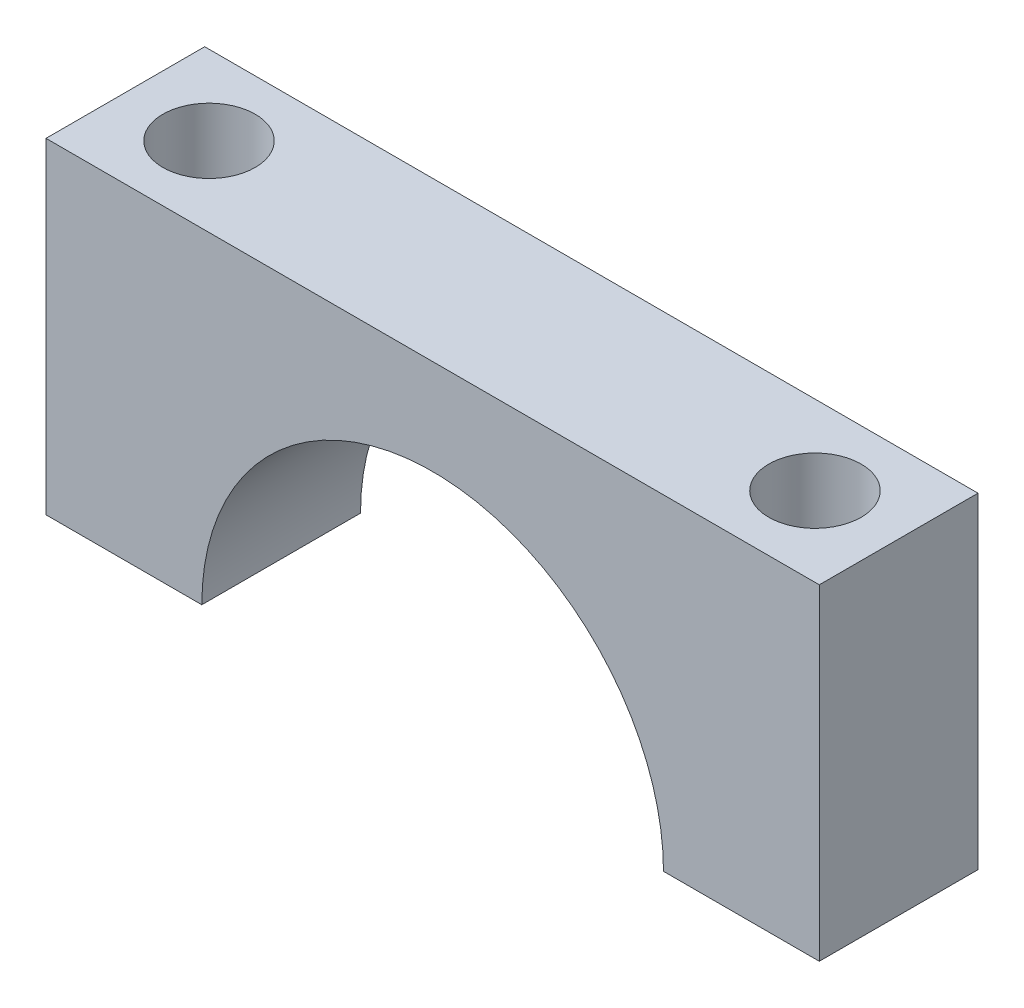
ISO-10303-21;
HEADER;
FILE_DESCRIPTION(('STEP AP214'),'2;1');
FILE_NAME('part.step','',(''),(''),'','','');
FILE_SCHEMA(('AUTOMOTIVE_DESIGN { 1 0 10303 214 1 1 1 1 }'));
ENDSEC;
DATA;
#1=APPLICATION_CONTEXT('core data for automotive mechanical design processes');
#2=APPLICATION_PROTOCOL_DEFINITION('international standard','automotive_design',2000,#1);
#3=PRODUCT_CONTEXT('',#1,'mechanical');
#4=PRODUCT('Part','Part','',(#3));
#5=PRODUCT_RELATED_PRODUCT_CATEGORY('part','',(#4));
#6=PRODUCT_DEFINITION_FORMATION('','',#4);
#7=PRODUCT_DEFINITION_CONTEXT('part definition',#1,'design');
#8=PRODUCT_DEFINITION('design','',#6,#7);
#9=PRODUCT_DEFINITION_SHAPE('','',#8);
#10=(LENGTH_UNIT() NAMED_UNIT(*) SI_UNIT(.MILLI.,.METRE.));
#11=(NAMED_UNIT(*) PLANE_ANGLE_UNIT() SI_UNIT($,.RADIAN.));
#12=(NAMED_UNIT(*) SI_UNIT($,.STERADIAN.) SOLID_ANGLE_UNIT());
#13=UNCERTAINTY_MEASURE_WITH_UNIT(LENGTH_MEASURE(1.E-05),#10,'distance_accuracy_value','');
#14=(GEOMETRIC_REPRESENTATION_CONTEXT(3) GLOBAL_UNCERTAINTY_ASSIGNED_CONTEXT((#13)) GLOBAL_UNIT_ASSIGNED_CONTEXT((#10,
#11,#12)) REPRESENTATION_CONTEXT('',''));
#15=CARTESIAN_POINT('',(0.,0.,0.));
#16=DIRECTION('',(0.,0.,1.));
#17=DIRECTION('',(1.,0.,0.));
#18=AXIS2_PLACEMENT_3D('',#15,#16,#17);
#19=CARTESIAN_POINT('',(-13.4,11.3,2.75));
#20=DIRECTION('',(1.,0.,0.));
#21=DIRECTION('',(0.,1.,0.));
#22=AXIS2_PLACEMENT_3D('',#19,#20,#21);
#23=PLANE('',#22);
#24=DIRECTION('',(0.,-1.,0.));
#25=VECTOR('',#24,1.);
#26=CARTESIAN_POINT('',(-13.4,11.3,-2.75));
#27=LINE('',#26,#25);
#28=CARTESIAN_POINT('',(-13.4,11.3,-2.75));
#29=VERTEX_POINT('',#28);
#30=CARTESIAN_POINT('',(-13.4,0.,-2.75));
#31=VERTEX_POINT('',#30);
#32=EDGE_CURVE('E123',#29,#31,#27,.T.);
#33=ORIENTED_EDGE('',*,*,#32,.T.);
#34=DIRECTION('',(0.,0.,-1.));
#35=VECTOR('',#34,1.);
#36=CARTESIAN_POINT('',(-13.4,0.,2.75));
#37=LINE('',#36,#35);
#38=CARTESIAN_POINT('',(-13.4,0.,2.75));
#39=VERTEX_POINT('',#38);
#40=EDGE_CURVE('E11',#39,#31,#37,.T.);
#41=ORIENTED_EDGE('',*,*,#40,.F.);
#42=DIRECTION('',(0.,-1.,0.));
#43=VECTOR('',#42,1.);
#44=CARTESIAN_POINT('',(-13.4,11.3,2.75));
#45=LINE('',#44,#43);
#46=CARTESIAN_POINT('',(-13.4,11.3,2.75));
#47=VERTEX_POINT('',#46);
#48=EDGE_CURVE('E134',#47,#39,#45,.T.);
#49=ORIENTED_EDGE('',*,*,#48,.F.);
#50=DIRECTION('',(0.,0.,-1.));
#51=VECTOR('',#50,1.);
#52=CARTESIAN_POINT('',(-13.4,11.3,2.75));
#53=LINE('',#52,#51);
#54=EDGE_CURVE('E119',#47,#29,#53,.T.);
#55=ORIENTED_EDGE('',*,*,#54,.T.);
#56=EDGE_LOOP('',(#33,#41,#49,#55));
#57=FACE_BOUND('',#56,.T.);
#58=ADVANCED_FACE('F39',(#57),#23,.F.);
#59=CARTESIAN_POINT('',(-13.4,0.,2.75));
#60=DIRECTION('',(0.,1.,0.));
#61=DIRECTION('',(-1.,0.,0.));
#62=AXIS2_PLACEMENT_3D('',#59,#60,#61);
#63=PLANE('',#62);
#64=CARTESIAN_POINT('',(-10.5,0.,0.));
#65=DIRECTION('',(0.,-1.,0.));
#66=DIRECTION('',(1.,0.,0.));
#67=AXIS2_PLACEMENT_3D('',#64,#65,#66);
#68=CIRCLE('',#67,1.6);
#69=CARTESIAN_POINT('',(-8.9,0.,0.));
#70=VERTEX_POINT('',#69);
#71=EDGE_CURVE('E185',#70,#70,#68,.T.);
#72=ORIENTED_EDGE('',*,*,#71,.F.);
#73=EDGE_LOOP('',(#72));
#74=FACE_BOUND('',#73,.T.);
#75=DIRECTION('',(1.,0.,0.));
#76=VECTOR('',#75,1.);
#77=CARTESIAN_POINT('',(-13.4,0.,-2.75));
#78=LINE('',#77,#76);
#79=CARTESIAN_POINT('',(-8.,0.,-2.75));
#80=VERTEX_POINT('',#79);
#81=EDGE_CURVE('E126',#31,#80,#78,.T.);
#82=ORIENTED_EDGE('',*,*,#81,.T.);
#83=DIRECTION('',(0.,0.,-1.));
#84=VECTOR('',#83,1.);
#85=CARTESIAN_POINT('',(-8.,0.,2.75));
#86=LINE('',#85,#84);
#87=CARTESIAN_POINT('',(-8.,0.,2.75));
#88=VERTEX_POINT('',#87);
#89=EDGE_CURVE('E47',#88,#80,#86,.T.);
#90=ORIENTED_EDGE('',*,*,#89,.F.);
#91=DIRECTION('',(1.,0.,0.));
#92=VECTOR('',#91,1.);
#93=CARTESIAN_POINT('',(-13.4,0.,2.75));
#94=LINE('',#93,#92);
#95=EDGE_CURVE('E92',#39,#88,#94,.T.);
#96=ORIENTED_EDGE('',*,*,#95,.F.);
#97=ORIENTED_EDGE('',*,*,#40,.T.);
#98=EDGE_LOOP('',(#82,#90,#96,#97));
#99=FACE_BOUND('',#98,.T.);
#100=ADVANCED_FACE('F163',(#74,#99),#63,.F.);
#101=CARTESIAN_POINT('',(0.,0.,2.75));
#102=DIRECTION('',(0.,0.,-1.));
#103=DIRECTION('',(-1.,0.,0.));
#104=AXIS2_PLACEMENT_3D('',#101,#102,#103);
#105=CYLINDRICAL_SURFACE('',#104,8.);
#106=CARTESIAN_POINT('',(0.,0.,-2.75));
#107=DIRECTION('',(0.,0.,-1.));
#108=DIRECTION('',(1.,0.,0.));
#109=AXIS2_PLACEMENT_3D('',#106,#107,#108);
#110=CIRCLE('',#109,8.);
#111=CARTESIAN_POINT('',(8.,0.,-2.75));
#112=VERTEX_POINT('',#111);
#113=EDGE_CURVE('E129',#80,#112,#110,.T.);
#114=ORIENTED_EDGE('',*,*,#113,.T.);
#115=DIRECTION('',(0.,0.,-1.));
#116=VECTOR('',#115,1.);
#117=CARTESIAN_POINT('',(8.,0.,2.75));
#118=LINE('',#117,#116);
#119=CARTESIAN_POINT('',(8.,0.,2.75));
#120=VERTEX_POINT('',#119);
#121=EDGE_CURVE('E114',#120,#112,#118,.T.);
#122=ORIENTED_EDGE('',*,*,#121,.F.);
#123=CARTESIAN_POINT('',(0.,0.,2.75));
#124=DIRECTION('',(0.,0.,-1.));
#125=DIRECTION('',(1.,0.,0.));
#126=AXIS2_PLACEMENT_3D('',#123,#124,#125);
#127=CIRCLE('',#126,8.);
#128=EDGE_CURVE('E105',#88,#120,#127,.T.);
#129=ORIENTED_EDGE('',*,*,#128,.F.);
#130=ORIENTED_EDGE('',*,*,#89,.T.);
#131=EDGE_LOOP('',(#114,#122,#129,#130));
#132=FACE_BOUND('',#131,.T.);
#133=ADVANCED_FACE('F140',(#132),#105,.F.);
#134=CARTESIAN_POINT('',(8.,0.,2.75));
#135=DIRECTION('',(0.,1.,0.));
#136=DIRECTION('',(-1.,0.,0.));
#137=AXIS2_PLACEMENT_3D('',#134,#135,#136);
#138=PLANE('',#137);
#139=CARTESIAN_POINT('',(10.5,0.,0.));
#140=DIRECTION('',(0.,-1.,0.));
#141=DIRECTION('',(1.,0.,0.));
#142=AXIS2_PLACEMENT_3D('',#139,#140,#141);
#143=CIRCLE('',#142,1.6);
#144=CARTESIAN_POINT('',(12.1,0.,0.));
#145=VERTEX_POINT('',#144);
#146=EDGE_CURVE('E180',#145,#145,#143,.T.);
#147=ORIENTED_EDGE('',*,*,#146,.F.);
#148=EDGE_LOOP('',(#147));
#149=FACE_BOUND('',#148,.T.);
#150=DIRECTION('',(1.,0.,0.));
#151=VECTOR('',#150,1.);
#152=CARTESIAN_POINT('',(8.,0.,-2.75));
#153=LINE('',#152,#151);
#154=CARTESIAN_POINT('',(13.4,0.,-2.75));
#155=VERTEX_POINT('',#154);
#156=EDGE_CURVE('E113',#112,#155,#153,.T.);
#157=ORIENTED_EDGE('',*,*,#156,.T.);
#158=DIRECTION('',(0.,0.,-1.));
#159=VECTOR('',#158,1.);
#160=CARTESIAN_POINT('',(13.4,0.,2.75));
#161=LINE('',#160,#159);
#162=CARTESIAN_POINT('',(13.4,0.,2.75));
#163=VERTEX_POINT('',#162);
#164=EDGE_CURVE('E110',#163,#155,#161,.T.);
#165=ORIENTED_EDGE('',*,*,#164,.F.);
#166=DIRECTION('',(1.,0.,0.));
#167=VECTOR('',#166,1.);
#168=CARTESIAN_POINT('',(8.,0.,2.75));
#169=LINE('',#168,#167);
#170=EDGE_CURVE('E99',#120,#163,#169,.T.);
#171=ORIENTED_EDGE('',*,*,#170,.F.);
#172=ORIENTED_EDGE('',*,*,#121,.T.);
#173=EDGE_LOOP('',(#157,#165,#171,#172));
#174=FACE_BOUND('',#173,.T.);
#175=ADVANCED_FACE('F111',(#149,#174),#138,.F.);
#176=CARTESIAN_POINT('',(13.4,11.3,2.75));
#177=DIRECTION('',(-1.,0.,0.));
#178=DIRECTION('',(0.,-1.,0.));
#179=AXIS2_PLACEMENT_3D('',#176,#177,#178);
#180=PLANE('',#179);
#181=DIRECTION('',(0.,1.,0.));
#182=VECTOR('',#181,1.);
#183=CARTESIAN_POINT('',(13.4,11.3,-2.75));
#184=LINE('',#183,#182);
#185=CARTESIAN_POINT('',(13.4,11.3,-2.75));
#186=VERTEX_POINT('',#185);
#187=EDGE_CURVE('E78',#155,#186,#184,.T.);
#188=ORIENTED_EDGE('',*,*,#187,.T.);
#189=DIRECTION('',(0.,0.,-1.));
#190=VECTOR('',#189,1.);
#191=CARTESIAN_POINT('',(13.4,11.3,2.75));
#192=LINE('',#191,#190);
#193=CARTESIAN_POINT('',(13.4,11.3,2.75));
#194=VERTEX_POINT('',#193);
#195=EDGE_CURVE('E115',#194,#186,#192,.T.);
#196=ORIENTED_EDGE('',*,*,#195,.F.);
#197=DIRECTION('',(0.,1.,0.));
#198=VECTOR('',#197,1.);
#199=CARTESIAN_POINT('',(13.4,11.3,2.75));
#200=LINE('',#199,#198);
#201=EDGE_CURVE('E103',#163,#194,#200,.T.);
#202=ORIENTED_EDGE('',*,*,#201,.F.);
#203=ORIENTED_EDGE('',*,*,#164,.T.);
#204=EDGE_LOOP('',(#188,#196,#202,#203));
#205=FACE_BOUND('',#204,.T.);
#206=ADVANCED_FACE('F117',(#205),#180,.F.);
#207=CARTESIAN_POINT('',(-13.4,11.3,2.75));
#208=DIRECTION('',(0.,-1.,0.));
#209=DIRECTION('',(1.,0.,0.));
#210=AXIS2_PLACEMENT_3D('',#207,#208,#209);
#211=PLANE('',#210);
#212=CARTESIAN_POINT('',(-10.5,11.3,0.));
#213=DIRECTION('',(0.,-1.,0.));
#214=DIRECTION('',(1.,0.,0.));
#215=AXIS2_PLACEMENT_3D('',#212,#213,#214);
#216=CIRCLE('',#215,1.6);
#217=CARTESIAN_POINT('',(-8.90000000000002,11.3,0.));
#218=VERTEX_POINT('',#217);
#219=EDGE_CURVE('E127',#218,#218,#216,.T.);
#220=ORIENTED_EDGE('',*,*,#219,.T.);
#221=EDGE_LOOP('',(#220));
#222=FACE_BOUND('',#221,.T.);
#223=CARTESIAN_POINT('',(10.5,11.3,0.));
#224=DIRECTION('',(0.,-1.,0.));
#225=DIRECTION('',(1.,0.,0.));
#226=AXIS2_PLACEMENT_3D('',#223,#224,#225);
#227=CIRCLE('',#226,1.6);
#228=CARTESIAN_POINT('',(12.1,11.3,0.));
#229=VERTEX_POINT('',#228);
#230=EDGE_CURVE('E182',#229,#229,#227,.T.);
#231=ORIENTED_EDGE('',*,*,#230,.T.);
#232=EDGE_LOOP('',(#231));
#233=FACE_BOUND('',#232,.T.);
#234=DIRECTION('',(-1.,0.,0.));
#235=VECTOR('',#234,1.);
#236=CARTESIAN_POINT('',(-13.4,11.3,-2.75));
#237=LINE('',#236,#235);
#238=EDGE_CURVE('E84',#186,#29,#237,.T.);
#239=ORIENTED_EDGE('',*,*,#238,.T.);
#240=ORIENTED_EDGE('',*,*,#54,.F.);
#241=DIRECTION('',(-1.,0.,0.));
#242=VECTOR('',#241,1.);
#243=CARTESIAN_POINT('',(-13.4,11.3,2.75));
#244=LINE('',#243,#242);
#245=EDGE_CURVE('E55',#194,#47,#244,.T.);
#246=ORIENTED_EDGE('',*,*,#245,.F.);
#247=ORIENTED_EDGE('',*,*,#195,.T.);
#248=EDGE_LOOP('',(#239,#240,#246,#247));
#249=FACE_BOUND('',#248,.T.);
#250=ADVANCED_FACE('F147',(#222,#233,#249),#211,.F.);
#251=CARTESIAN_POINT('',(0.,0.,2.75));
#252=DIRECTION('',(0.,0.,1.));
#253=DIRECTION('',(1.,0.,0.));
#254=AXIS2_PLACEMENT_3D('',#251,#252,#253);
#255=PLANE('',#254);
#256=ORIENTED_EDGE('',*,*,#48,.T.);
#257=ORIENTED_EDGE('',*,*,#95,.T.);
#258=ORIENTED_EDGE('',*,*,#128,.T.);
#259=ORIENTED_EDGE('',*,*,#170,.T.);
#260=ORIENTED_EDGE('',*,*,#201,.T.);
#261=ORIENTED_EDGE('',*,*,#245,.T.);
#262=EDGE_LOOP('',(#256,#257,#258,#259,#260,#261));
#263=FACE_BOUND('',#262,.T.);
#264=ADVANCED_FACE('F101',(#263),#255,.T.);
#265=CARTESIAN_POINT('',(0.,0.,-2.75));
#266=DIRECTION('',(0.,0.,1.));
#267=DIRECTION('',(1.,0.,0.));
#268=AXIS2_PLACEMENT_3D('',#265,#266,#267);
#269=PLANE('',#268);
#270=ORIENTED_EDGE('',*,*,#32,.F.);
#271=ORIENTED_EDGE('',*,*,#238,.F.);
#272=ORIENTED_EDGE('',*,*,#187,.F.);
#273=ORIENTED_EDGE('',*,*,#156,.F.);
#274=ORIENTED_EDGE('',*,*,#113,.F.);
#275=ORIENTED_EDGE('',*,*,#81,.F.);
#276=EDGE_LOOP('',(#270,#271,#272,#273,#274,#275));
#277=FACE_BOUND('',#276,.T.);
#278=ADVANCED_FACE('F143',(#277),#269,.F.);
#279=CARTESIAN_POINT('',(10.5,11.3,0.));
#280=DIRECTION('',(0.,-1.,0.));
#281=DIRECTION('',(1.,0.,0.));
#282=AXIS2_PLACEMENT_3D('',#279,#280,#281);
#283=CYLINDRICAL_SURFACE('',#282,1.6);
#284=ORIENTED_EDGE('',*,*,#230,.F.);
#285=EDGE_LOOP('',(#284));
#286=FACE_BOUND('',#285,.T.);
#287=ORIENTED_EDGE('',*,*,#146,.T.);
#288=EDGE_LOOP('',(#287));
#289=FACE_BOUND('',#288,.T.);
#290=ADVANCED_FACE('F197',(#286,#289),#283,.F.);
#291=CARTESIAN_POINT('',(-10.5,11.3,0.));
#292=DIRECTION('',(0.,-1.,0.));
#293=DIRECTION('',(1.,0.,0.));
#294=AXIS2_PLACEMENT_3D('',#291,#292,#293);
#295=CYLINDRICAL_SURFACE('',#294,1.6);
#296=ORIENTED_EDGE('',*,*,#219,.F.);
#297=EDGE_LOOP('',(#296));
#298=FACE_BOUND('',#297,.T.);
#299=ORIENTED_EDGE('',*,*,#71,.T.);
#300=EDGE_LOOP('',(#299));
#301=FACE_BOUND('',#300,.T.);
#302=ADVANCED_FACE('F194',(#298,#301),#295,.F.);
#303=CLOSED_SHELL('',(#58,#100,#133,#175,#206,#250,#264,#278,#290,#302));
#304=MANIFOLD_SOLID_BREP('B2',#303);
#305=ADVANCED_BREP_SHAPE_REPRESENTATION('',(#18,#304),#14);
#306=SHAPE_DEFINITION_REPRESENTATION(#9,#305);
ENDSEC;
END-ISO-10303-21;
